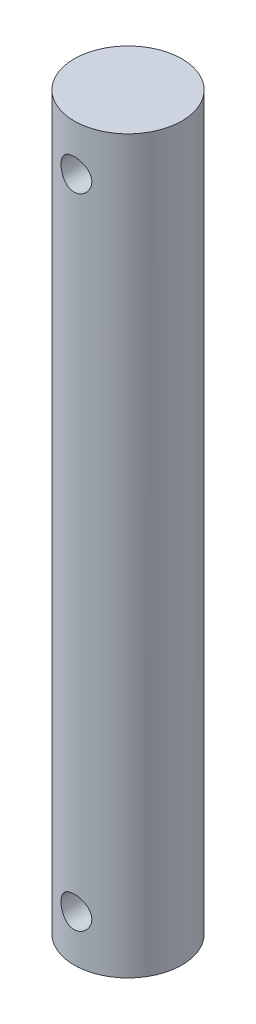
ISO-10303-21;
HEADER;
FILE_DESCRIPTION(('STEP AP214'),'2;1');
FILE_NAME('part.step','',(''),(''),'','','');
FILE_SCHEMA(('AUTOMOTIVE_DESIGN { 1 0 10303 214 1 1 1 1 }'));
ENDSEC;
DATA;
#1=APPLICATION_CONTEXT('core data for automotive mechanical design processes');
#2=APPLICATION_PROTOCOL_DEFINITION('international standard','automotive_design',2000,#1);
#3=PRODUCT_CONTEXT('',#1,'mechanical');
#4=PRODUCT('Part','Part','',(#3));
#5=PRODUCT_RELATED_PRODUCT_CATEGORY('part','',(#4));
#6=PRODUCT_DEFINITION_FORMATION('','',#4);
#7=PRODUCT_DEFINITION_CONTEXT('part definition',#1,'design');
#8=PRODUCT_DEFINITION('design','',#6,#7);
#9=PRODUCT_DEFINITION_SHAPE('','',#8);
#10=(LENGTH_UNIT() NAMED_UNIT(*) SI_UNIT(.MILLI.,.METRE.));
#11=(NAMED_UNIT(*) PLANE_ANGLE_UNIT() SI_UNIT($,.RADIAN.));
#12=(NAMED_UNIT(*) SI_UNIT($,.STERADIAN.) SOLID_ANGLE_UNIT());
#13=UNCERTAINTY_MEASURE_WITH_UNIT(LENGTH_MEASURE(1.E-05),#10,'distance_accuracy_value','');
#14=(GEOMETRIC_REPRESENTATION_CONTEXT(3) GLOBAL_UNCERTAINTY_ASSIGNED_CONTEXT((#13)) GLOBAL_UNIT_ASSIGNED_CONTEXT((#10,
#11,#12)) REPRESENTATION_CONTEXT('',''));
#15=CARTESIAN_POINT('',(0.,0.,0.));
#16=DIRECTION('',(0.,0.,1.));
#17=DIRECTION('',(1.,0.,0.));
#18=AXIS2_PLACEMENT_3D('',#15,#16,#17);
#19=CARTESIAN_POINT('',(0.,54.5,0.));
#20=DIRECTION('',(0.,-1.,0.));
#21=DIRECTION('',(0.,0.,-1.));
#22=AXIS2_PLACEMENT_3D('',#19,#20,#21);
#23=CYLINDRICAL_SURFACE('',#22,3.5);
#24=CARTESIAN_POINT('',(0.,51.5,0.));
#25=DIRECTION('',(0.,1.,0.));
#26=DIRECTION('',(0.,0.,1.));
#27=AXIS2_PLACEMENT_3D('',#24,#25,#26);
#28=CIRCLE('',#27,3.5);
#29=CARTESIAN_POINT('',(0.,51.5,3.5));
#30=VERTEX_POINT('',#29);
#31=EDGE_CURVE('E70',#30,#30,#28,.T.);
#32=ORIENTED_EDGE('',*,*,#31,.F.);
#33=EDGE_LOOP('',(#32));
#34=FACE_BOUND('',#33,.T.);
#35=CARTESIAN_POINT('',(0.,8.,-3.5));
#36=CARTESIAN_POINT('',(-0.0549774511886257,7.99999903021903,-3.49999934647171));
#37=CARTESIAN_POINT('',(-0.109964873936291,7.99545110551194,-3.49869208701023));
#38=CARTESIAN_POINT('',(-0.218345995598494,7.97741786494885,-3.49360452972549));
#39=CARTESIAN_POINT('',(-0.271739083414807,7.96392916696296,-3.48982329605034));
#40=CARTESIAN_POINT('',(-0.375352150368936,7.92849598079175,-3.48020345674544));
#41=CARTESIAN_POINT('',(-0.425576440424114,7.90656328192402,-3.474367720532));
#42=CARTESIAN_POINT('',(-0.521634380564635,7.85491100426084,-3.46124989158242));
#43=CARTESIAN_POINT('',(-0.567467570589077,7.82519061075486,-3.45396764753901));
#44=CARTESIAN_POINT('',(-0.654647223429478,7.7579824946635,-3.43852367312902));
#45=CARTESIAN_POINT('',(-0.695861861190489,7.72032762307222,-3.4303452097302));
#46=CARTESIAN_POINT('',(-0.771485678962154,7.63867612843131,-3.41413367457396));
#47=CARTESIAN_POINT('',(-0.805893838538838,7.59467855618443,-3.40610062478085));
#48=CARTESIAN_POINT('',(-0.867598950032228,7.50050320860399,-3.39091507439313));
#49=CARTESIAN_POINT('',(-0.894739105517028,7.45021900746547,-3.38378351259108));
#50=CARTESIAN_POINT('',(-0.940125852769615,7.34556399412672,-3.37145671914235));
#51=CARTESIAN_POINT('',(-0.958374357777524,7.2911940639724,-3.36626107099664));
#52=CARTESIAN_POINT('',(-0.984992165068876,7.18138261841595,-3.35856804120241));
#53=CARTESIAN_POINT('',(-0.993602766016075,7.12600431860089,-3.35600489366891));
#54=CARTESIAN_POINT('',(-1.00145333894795,7.01453442575838,-3.35367104182518));
#55=CARTESIAN_POINT('',(-1.00069534704803,6.95844299036685,-3.35389973075333));
#56=CARTESIAN_POINT('',(-0.990020673813953,6.8490656942732,-3.35706517184156));
#57=CARTESIAN_POINT('',(-0.980401628641805,6.79574782440997,-3.35991391343389));
#58=CARTESIAN_POINT('',(-0.952756930429097,6.69151639018586,-3.36785674196985));
#59=CARTESIAN_POINT('',(-0.934730517406289,6.64060304363966,-3.37295103189706));
#60=CARTESIAN_POINT('',(-0.890553405689019,6.54187687778419,-3.38488431756517));
#61=CARTESIAN_POINT('',(-0.864302755864396,6.49411146379919,-3.39174458202416));
#62=CARTESIAN_POINT('',(-0.804491895839434,6.40356171939327,-3.40642608441438));
#63=CARTESIAN_POINT('',(-0.770930058366727,6.36077850113254,-3.41424753611068));
#64=CARTESIAN_POINT('',(-0.695951998365101,6.27971381219682,-3.43033125328062));
#65=CARTESIAN_POINT('',(-0.654287437422663,6.24166276201639,-3.43859902286152));
#66=CARTESIAN_POINT('',(-0.565066141193113,6.17303699817986,-3.45438123609203));
#67=CARTESIAN_POINT('',(-0.517509100740946,6.14246267197914,-3.46189564068921));
#68=CARTESIAN_POINT('',(-0.417461536545723,6.08953563261298,-3.47538264032742));
#69=CARTESIAN_POINT('',(-0.364944908905003,6.06722985659791,-3.48134637748612));
#70=CARTESIAN_POINT('',(-0.256696614983735,6.03183305429159,-3.49099625743795));
#71=CARTESIAN_POINT('',(-0.200965762905073,6.01873970537736,-3.49468297428128));
#72=CARTESIAN_POINT('',(-0.089833194322175,6.00251335714527,-3.49927437257336));
#73=CARTESIAN_POINT('',(-0.0344806734302539,5.99906765231349,-3.50026636425301));
#74=CARTESIAN_POINT('',(0.0760132634027908,6.00136363315052,-3.49961042353544));
#75=CARTESIAN_POINT('',(0.131154703878552,6.00710421642296,-3.49796280790308));
#76=CARTESIAN_POINT('',(0.238509316715159,6.02735522215813,-3.49226963342609));
#77=CARTESIAN_POINT('',(0.290759105867427,6.04168659066171,-3.48827306508862));
#78=CARTESIAN_POINT('',(0.392104343102815,6.07850025099232,-3.4783399937092));
#79=CARTESIAN_POINT('',(0.441199425624338,6.10098348544461,-3.47240326632854));
#80=CARTESIAN_POINT('',(0.536020842560038,6.15401166832262,-3.45904980584657));
#81=CARTESIAN_POINT('',(0.581651243270127,6.18472059941289,-3.45160381589488));
#82=CARTESIAN_POINT('',(0.667219264029655,6.25312625297532,-3.43608973548903));
#83=CARTESIAN_POINT('',(0.707155585421215,6.29082456503144,-3.42802150376367));
#84=CARTESIAN_POINT('',(0.781553214170353,6.3736046710256,-3.41184309815947));
#85=CARTESIAN_POINT('',(0.81579271370477,6.41888763778285,-3.40374018433795));
#86=CARTESIAN_POINT('',(0.87619765803258,6.51473129430901,-3.38869447362751));
#87=CARTESIAN_POINT('',(0.902363383738855,6.56529180037321,-3.3817516363796));
#88=CARTESIAN_POINT('',(0.945687270594172,6.67004560549588,-3.36989325638715));
#89=CARTESIAN_POINT('',(0.962893166212217,6.72421788178634,-3.36496700079018));
#90=CARTESIAN_POINT('',(0.987897250353704,6.8348549678272,-3.35771228398834));
#91=CARTESIAN_POINT('',(0.995698289511611,6.89131907755101,-3.35538303564047));
#92=CARTESIAN_POINT('',(1.00149012123096,7.00264801646077,-3.35365851547575));
#93=CARTESIAN_POINT('',(0.999840138221142,7.05749275227629,-3.35415580399703));
#94=CARTESIAN_POINT('',(0.987623554788215,7.16608736533289,-3.35777298607399));
#95=CARTESIAN_POINT('',(0.977057251899602,7.2198372790465,-3.36089279211716));
#96=CARTESIAN_POINT('',(0.947529844083142,7.32418918558376,-3.36933488579116));
#97=CARTESIAN_POINT('',(0.928655458931764,7.37481769350544,-3.37463438524179));
#98=CARTESIAN_POINT('',(0.883114746507969,7.47222936724624,-3.38683651421364));
#99=CARTESIAN_POINT('',(0.856447040215778,7.51901185063665,-3.3937394274128));
#100=CARTESIAN_POINT('',(0.795032732674125,7.60909176090262,-3.40865834474881));
#101=CARTESIAN_POINT('',(0.760046138613656,7.65222069567097,-3.41670381589509));
#102=CARTESIAN_POINT('',(0.683429920189678,7.73211194790492,-3.43284922546139));
#103=CARTESIAN_POINT('',(0.64179862536428,7.7688726595554,-3.4409491770859));
#104=CARTESIAN_POINT('',(0.551787160432695,7.83591859216331,-3.45653979786176));
#105=CARTESIAN_POINT('',(0.50326125117989,7.86601349363481,-3.46400950518705));
#106=CARTESIAN_POINT('',(0.401625264823331,7.917572892511,-3.47725697888987));
#107=CARTESIAN_POINT('',(0.34851771205737,7.93904210596653,-3.48303566935144));
#108=CARTESIAN_POINT('',(0.246458157667518,7.97042377569772,-3.49163672362653));
#109=CARTESIAN_POINT('',(0.197881503812196,7.98148676834228,-3.49474842181038));
#110=CARTESIAN_POINT('',(0.0995391843931842,7.99627482862107,-3.49893021926074));
#111=CARTESIAN_POINT('',(0.0497736788080462,8.00000087798844,-3.50000059166997));
#112=CARTESIAN_POINT('',(0.,8.,-3.5));
#113=B_SPLINE_CURVE_WITH_KNOTS('',3,(#35,#36,#37,#38,#39,#40,#41,#42,#43,#44,#45,#46,#47,#48,
#49,#50,#51,#52,#53,#54,#55,#56,#57,#58,#59,#60,#61,#62,#63,#64,#65,#66,#67,#68,#69,#70,#71,#72,
#73,#74,#75,#76,#77,#78,#79,#80,#81,#82,#83,#84,#85,#86,#87,#88,#89,#90,#91,#92,#93,#94,#95,#96,
#97,#98,#99,#100,#101,#102,#103,#104,#105,#106,#107,#108,#109,#110,#111,#112),.UNSPECIFIED.,.T.,
.F.,(4,2,2,2,2,2,2,2,2,2,2,2,2,2,2,2,2,2,2,2,2,2,2,2,2,2,2,2,2,2,2,2,2,2,2,2,2,2,4),(0.,
0.164749656271172,0.32956166989759,0.494144406447672,0.658744367717579,0.827239057653907,
0.995758989368566,1.16766537650029,1.33953475772405,1.50699754929408,1.67442394611628,
1.83642392910678,1.99843855889074,2.16250401641616,2.32660602784683,2.49689250297262,
2.66718780073735,2.83843550548235,3.00964002003317,3.17522728845111,3.34079468713335,
3.50302570235771,3.66527548283775,3.83103762668237,3.99683751589905,4.16806052438178,
4.3392775747866,4.50957286677749,4.6798165288708,4.84363340801449,5.00744482086202,
5.16958548138845,5.33175484992001,5.49933828438395,5.66696391547449,5.83888989478295,
6.01072174610257,6.15989734012185,6.30905297207072),.UNSPECIFIED.);
#114=CARTESIAN_POINT('',(0.,8.,-3.5));
#115=VERTEX_POINT('',#114);
#116=EDGE_CURVE('E42',#115,#115,#113,.T.);
#117=ORIENTED_EDGE('',*,*,#116,.T.);
#118=EDGE_LOOP('',(#117));
#119=FACE_BOUND('',#118,.T.);
#120=CARTESIAN_POINT('',(1.,7.,3.35410196624968));
#121=CARTESIAN_POINT('',(0.999999010234618,6.94507423107725,3.3541027352982));
#122=CARTESIAN_POINT('',(0.995459333009393,6.89013845792023,3.35546589937234));
#123=CARTESIAN_POINT('',(0.977461816962148,6.78186438061244,3.36075194701915));
#124=CARTESIAN_POINT('',(0.964000350683299,6.72852673545843,3.36467587174621));
#125=CARTESIAN_POINT('',(0.928646716460409,6.6250313995488,3.37460354734501));
#126=CARTESIAN_POINT('',(0.906767603258319,6.57486892408729,3.38060407621639));
#127=CARTESIAN_POINT('',(0.855241820315741,6.47891609422696,3.3940046055512));
#128=CARTESIAN_POINT('',(0.825594228332019,6.43312625981211,3.40140477214508));
#129=CARTESIAN_POINT('',(0.758462400490702,6.34590421734143,3.41700891605117));
#130=CARTESIAN_POINT('',(0.720794605566169,6.30461609893508,3.42522877981549));
#131=CARTESIAN_POINT('',(0.639085622734713,6.22884860834841,3.44140982756535));
#132=CARTESIAN_POINT('',(0.595043689579838,6.19437003343866,3.44937098116968));
#133=CARTESIAN_POINT('',(0.500823016078774,6.13258567582316,3.46431666000611));
#134=CARTESIAN_POINT('',(0.450545391880929,6.10542519012449,3.47128027250394));
#135=CARTESIAN_POINT('',(0.345904237619826,6.05999911279204,3.48326270242804));
#136=CARTESIAN_POINT('',(0.291541505437589,6.04173178937987,3.48828189845443));
#137=CARTESIAN_POINT('',(0.181779287560588,6.01508276938014,3.49569759650108));
#138=CARTESIAN_POINT('',(0.126443899064521,6.00645548914766,3.49815913505649));
#139=CARTESIAN_POINT('',(0.0150600512109633,5.99855663305838,3.50041047829849));
#140=CARTESIAN_POINT('',(-0.0409882697942731,5.99928326883132,3.50020079369491));
#141=CARTESIAN_POINT('',(-0.15049009786761,6.00990318745901,3.49718003381653));
#142=CARTESIAN_POINT('',(-0.203971773054472,6.01953080631899,3.49444435388027));
#143=CARTESIAN_POINT('',(-0.308526111088808,6.04724755123219,3.48676943165067));
#144=CARTESIAN_POINT('',(-0.359598627150253,6.06533719213106,3.48183005528105));
#145=CARTESIAN_POINT('',(-0.458536916864461,6.10965470040591,3.47019515886062));
#146=CARTESIAN_POINT('',(-0.506361521925385,6.13596938890417,3.46348102756093));
#147=CARTESIAN_POINT('',(-0.597003621795241,6.19592229319901,3.44901384486994));
#148=CARTESIAN_POINT('',(-0.639820016208003,6.22956211383323,3.44126056595877));
#149=CARTESIAN_POINT('',(-0.720816324273876,6.3046028553093,3.42522841509913));
#150=CARTESIAN_POINT('',(-0.758780788792452,6.34623471680255,3.41694064685079));
#151=CARTESIAN_POINT('',(-0.827246507874876,6.43535754592295,3.4010148689311));
#152=CARTESIAN_POINT('',(-0.857747156891286,6.48284898847439,3.39337691201241));
#153=CARTESIAN_POINT('',(-0.910616679927254,6.58286544224911,3.37957587408658));
#154=CARTESIAN_POINT('',(-0.932918688943925,6.63542761252626,3.37342505474766));
#155=CARTESIAN_POINT('',(-0.96829475748038,6.74377658175188,3.36344272188227));
#156=CARTESIAN_POINT('',(-0.98137150201329,6.79956243732834,3.35961053356453));
#157=CARTESIAN_POINT('',(-0.997537085998827,6.91074021216189,3.35484557617748));
#158=CARTESIAN_POINT('',(-1.00095074078696,6.96608090846043,3.35381855730448));
#159=CARTESIAN_POINT('',(-0.998594983598454,7.07654415795746,3.35452079870229));
#160=CARTESIAN_POINT('',(-0.992826717122485,7.1316667375073,3.35624971515342));
#161=CARTESIAN_POINT('',(-0.972558907129289,7.23882061401528,3.36217715008271));
#162=CARTESIAN_POINT('',(-0.958262310920608,7.2908937930086,3.3663182147774));
#163=CARTESIAN_POINT('',(-0.921575809332241,7.39190093599785,3.37654531970352));
#164=CARTESIAN_POINT('',(-0.899184736133866,7.44083444582255,3.38263164056921));
#165=CARTESIAN_POINT('',(-0.846309825608091,7.53551103760866,3.3962509400331));
#166=CARTESIAN_POINT('',(-0.81563945864565,7.58114522210117,3.40381598690189));
#167=CARTESIAN_POINT('',(-0.747302318424214,7.6667381867216,3.41946863275287));
#168=CARTESIAN_POINT('',(-0.709634028840686,7.70669573350605,3.42755634473907));
#169=CARTESIAN_POINT('',(-0.626854004982777,7.78118970914411,3.44367363717939));
#170=CARTESIAN_POINT('',(-0.581533855120274,7.81549748570937,3.45169203023043));
#171=CARTESIAN_POINT('',(-0.485592653528774,7.87602284069136,3.46648988523027));
#172=CARTESIAN_POINT('',(-0.434971879049092,7.90224084196119,3.47326941192714));
#173=CARTESIAN_POINT('',(-0.330216636478084,7.94559214351316,3.48478252423195));
#174=CARTESIAN_POINT('',(-0.276112399949819,7.96279419479308,3.48953154063622));
#175=CARTESIAN_POINT('',(-0.165622824274962,7.98781340097009,3.49651669811944));
#176=CARTESIAN_POINT('',(-0.109238075792719,7.99563297009066,3.4987534856151));
#177=CARTESIAN_POINT('',(0.00208911897951452,8.00149571699889,3.50042667501642));
#178=CARTESIAN_POINT('',(0.0570128155249782,7.99987207454141,3.49995851794498));
#179=CARTESIAN_POINT('',(0.165772586211002,7.98768085929485,3.49649534561067));
#180=CARTESIAN_POINT('',(0.219608712308765,7.97711371480898,3.49350045135296));
#181=CARTESIAN_POINT('',(0.324202066519794,7.94753431951058,3.48534400930059));
#182=CARTESIAN_POINT('',(0.374982516717525,7.92859841052801,3.4802020702409));
#183=CARTESIAN_POINT('',(0.472673601380731,7.88288692085726,3.46828547071724));
#184=CARTESIAN_POINT('',(0.51958363529034,7.85611012645387,3.46151055750883));
#185=CARTESIAN_POINT('',(0.609716728176955,7.7945513312876,3.44679477720104));
#186=CARTESIAN_POINT('',(0.652788664003538,7.75955495660581,3.43882522893152));
#187=CARTESIAN_POINT('',(0.732560611159188,7.68294543727302,3.42272032493228));
#188=CARTESIAN_POINT('',(0.769258856094888,7.64133046445754,3.4145849239342));
#189=CARTESIAN_POINT('',(0.836204230145643,7.55135154150232,3.39882018772077));
#190=CARTESIAN_POINT('',(0.866256583618025,7.50283902624844,3.39120975884781));
#191=CARTESIAN_POINT('',(0.91773971809804,7.40123906734251,3.37764222665283));
#192=CARTESIAN_POINT('',(0.939175324424089,7.34815420445517,3.37168419857914));
#193=CARTESIAN_POINT('',(0.970492670062521,7.24617314988425,3.36279229780033));
#194=CARTESIAN_POINT('',(0.981529499909265,7.19765482595075,3.3595621942308));
#195=CARTESIAN_POINT('',(0.996283035217829,7.09942694082203,3.35521684727178));
#196=CARTESIAN_POINT('',(1.00000089591333,7.04971756887699,3.35410127012429));
#197=CARTESIAN_POINT('',(1.,7.,3.35410196624968));
#198=B_SPLINE_CURVE_WITH_KNOTS('',3,(#120,#121,#122,#123,#124,#125,#126,#127,#128,#129,#130,
#131,#132,#133,#134,#135,#136,#137,#138,#139,#140,#141,#142,#143,#144,#145,#146,#147,#148,#149,
#150,#151,#152,#153,#154,#155,#156,#157,#158,#159,#160,#161,#162,#163,#164,#165,#166,#167,#168,
#169,#170,#171,#172,#173,#174,#175,#176,#177,#178,#179,#180,#181,#182,#183,#184,#185,#186,#187,
#188,#189,#190,#191,#192,#193,#194,#195,#196,#197),.UNSPECIFIED.,.T.,.F.,(4,2,2,2,2,2,2,2,2,2,2,
2,2,2,2,2,2,2,2,2,2,2,2,2,2,2,2,2,2,2,2,2,2,2,2,2,2,2,4),(0.,0.164594171159104,0.32925530476515,
0.493662091823938,0.658088405459393,0.826785835988801,0.995503006148133,1.16735741502495,
1.33917834504425,1.50651450509943,1.67381867271781,1.83628518817283,1.99876158968833,
2.16301451684817,2.32730346587989,2.49735806342072,2.66742645310452,2.83885260310575,
3.01022883892078,3.17577181660546,3.34129414341278,3.50302644820309,3.66478209600074,
3.83054003013244,3.99633392302106,4.16772694180382,4.33911100034377,4.50916842641098,
4.67918208530373,4.84323448834084,5.00727903537341,5.16985706186659,5.33246026763665,
5.4998988436474,5.66738374949711,5.83926806202707,6.01105598599879,6.16006644425301,
6.30905338065554),.UNSPECIFIED.);
#199=CARTESIAN_POINT('',(1.,7.,3.35410196624968));
#200=VERTEX_POINT('',#199);
#201=EDGE_CURVE('E49',#200,#200,#198,.T.);
#202=ORIENTED_EDGE('',*,*,#201,.T.);
#203=EDGE_LOOP('',(#202));
#204=FACE_BOUND('',#203,.T.);
#205=CARTESIAN_POINT('',(0.,49.5,-3.5));
#206=CARTESIAN_POINT('',(-0.0549774511886254,49.499999030219,-3.49999934647171));
#207=CARTESIAN_POINT('',(-0.10996487393629,49.4954511055119,-3.49869208701023));
#208=CARTESIAN_POINT('',(-0.218345995598493,49.4774178649488,-3.4936045297255));
#209=CARTESIAN_POINT('',(-0.271739083414807,49.463929166963,-3.48982329605034));
#210=CARTESIAN_POINT('',(-0.375352150368936,49.4284959807918,-3.48020345674544));
#211=CARTESIAN_POINT('',(-0.425576440424114,49.406563281924,-3.474367720532));
#212=CARTESIAN_POINT('',(-0.521634380564635,49.3549110042608,-3.46124989158242));
#213=CARTESIAN_POINT('',(-0.567467570589077,49.3251906107549,-3.45396764753901));
#214=CARTESIAN_POINT('',(-0.654647223429478,49.2579824946635,-3.43852367312902));
#215=CARTESIAN_POINT('',(-0.69586186119049,49.2203276230722,-3.4303452097302));
#216=CARTESIAN_POINT('',(-0.771485678962155,49.1386761284313,-3.41413367457396));
#217=CARTESIAN_POINT('',(-0.805893838538838,49.0946785561844,-3.40610062478085));
#218=CARTESIAN_POINT('',(-0.867598950032228,49.000503208604,-3.39091507439313));
#219=CARTESIAN_POINT('',(-0.894739105517028,48.9502190074655,-3.38378351259108));
#220=CARTESIAN_POINT('',(-0.940125852769615,48.8455639941267,-3.37145671914235));
#221=CARTESIAN_POINT('',(-0.958374357777523,48.7911940639724,-3.36626107099664));
#222=CARTESIAN_POINT('',(-0.984992165068876,48.6813826184159,-3.35856804120241));
#223=CARTESIAN_POINT('',(-0.993602766016076,48.6260043186009,-3.35600489366891));
#224=CARTESIAN_POINT('',(-1.00145333894795,48.5145344257584,-3.35367104182518));
#225=CARTESIAN_POINT('',(-1.00069534704803,48.4584429903668,-3.35389973075333));
#226=CARTESIAN_POINT('',(-0.990020673813952,48.3490656942732,-3.35706517184156));
#227=CARTESIAN_POINT('',(-0.980401628641804,48.29574782441,-3.35991391343389));
#228=CARTESIAN_POINT('',(-0.952756930429097,48.1915163901859,-3.36785674196985));
#229=CARTESIAN_POINT('',(-0.93473051740629,48.1406030436397,-3.37295103189705));
#230=CARTESIAN_POINT('',(-0.89055340568902,48.0418768777842,-3.38488431756517));
#231=CARTESIAN_POINT('',(-0.864302755864395,47.9941114637992,-3.39174458202416));
#232=CARTESIAN_POINT('',(-0.804491895839433,47.9035617193933,-3.40642608441438));
#233=CARTESIAN_POINT('',(-0.770930058366726,47.8607785011325,-3.41424753611068));
#234=CARTESIAN_POINT('',(-0.695951998365101,47.7797138121968,-3.43033125328062));
#235=CARTESIAN_POINT('',(-0.654287437422663,47.7416627620164,-3.43859902286152));
#236=CARTESIAN_POINT('',(-0.565066141193115,47.6730369981799,-3.45438123609203));
#237=CARTESIAN_POINT('',(-0.517509100740948,47.6424626719791,-3.46189564068921));
#238=CARTESIAN_POINT('',(-0.417461536545725,47.589535632613,-3.47538264032742));
#239=CARTESIAN_POINT('',(-0.364944908905005,47.5672298565979,-3.48134637748612));
#240=CARTESIAN_POINT('',(-0.256696614983738,47.5318330542916,-3.49099625743795));
#241=CARTESIAN_POINT('',(-0.200965762905076,47.5187397053774,-3.49468297428128));
#242=CARTESIAN_POINT('',(-0.0898331943221773,47.5025133571453,-3.49927437257336));
#243=CARTESIAN_POINT('',(-0.0344806734302556,47.4990676523135,-3.50026636425301));
#244=CARTESIAN_POINT('',(0.0760132634027893,47.5013636331505,-3.49961042353544));
#245=CARTESIAN_POINT('',(0.131154703878551,47.507104216423,-3.49796280790309));
#246=CARTESIAN_POINT('',(0.238509316715158,47.5273552221581,-3.49226963342609));
#247=CARTESIAN_POINT('',(0.290759105867427,47.5416865906617,-3.48827306508862));
#248=CARTESIAN_POINT('',(0.392104343102814,47.5785002509923,-3.4783399937092));
#249=CARTESIAN_POINT('',(0.441199425624336,47.6009834854446,-3.47240326632854));
#250=CARTESIAN_POINT('',(0.536020842560036,47.6540116683226,-3.45904980584657));
#251=CARTESIAN_POINT('',(0.581651243270126,47.6847205994129,-3.45160381589488));
#252=CARTESIAN_POINT('',(0.667219264029654,47.7531262529753,-3.43608973548903));
#253=CARTESIAN_POINT('',(0.707155585421213,47.7908245650314,-3.42802150376367));
#254=CARTESIAN_POINT('',(0.781553214170352,47.8736046710256,-3.41184309815947));
#255=CARTESIAN_POINT('',(0.815792713704769,47.9188876377828,-3.40374018433795));
#256=CARTESIAN_POINT('',(0.876197658032579,48.014731294309,-3.38869447362751));
#257=CARTESIAN_POINT('',(0.902363383738854,48.0652918003732,-3.3817516363796));
#258=CARTESIAN_POINT('',(0.945687270594171,48.1700456054959,-3.36989325638715));
#259=CARTESIAN_POINT('',(0.962893166212216,48.2242178817863,-3.36496700079018));
#260=CARTESIAN_POINT('',(0.987897250353704,48.3348549678272,-3.35771228398834));
#261=CARTESIAN_POINT('',(0.995698289511611,48.391319077551,-3.35538303564047));
#262=CARTESIAN_POINT('',(1.00149012123096,48.5026480164608,-3.35365851547575));
#263=CARTESIAN_POINT('',(0.999840138221142,48.5574927522763,-3.35415580399703));
#264=CARTESIAN_POINT('',(0.987623554788215,48.6660873653329,-3.35777298607399));
#265=CARTESIAN_POINT('',(0.977057251899602,48.7198372790465,-3.36089279211716));
#266=CARTESIAN_POINT('',(0.947529844083144,48.8241891855838,-3.36933488579116));
#267=CARTESIAN_POINT('',(0.928655458931766,48.8748176935054,-3.37463438524179));
#268=CARTESIAN_POINT('',(0.883114746507973,48.9722293672462,-3.38683651421364));
#269=CARTESIAN_POINT('',(0.856447040215782,49.0190118506367,-3.39373942741279));
#270=CARTESIAN_POINT('',(0.795032732674129,49.1090917609026,-3.40865834474881));
#271=CARTESIAN_POINT('',(0.760046138613661,49.152220695671,-3.41670381589508));
#272=CARTESIAN_POINT('',(0.683429920189683,49.2321119479049,-3.43284922546139));
#273=CARTESIAN_POINT('',(0.641798625364285,49.2688726595554,-3.4409491770859));
#274=CARTESIAN_POINT('',(0.5517871604327,49.3359185921633,-3.45653979786176));
#275=CARTESIAN_POINT('',(0.503261251179895,49.3660134936348,-3.46400950518705));
#276=CARTESIAN_POINT('',(0.401625264823334,49.417572892511,-3.47725697888987));
#277=CARTESIAN_POINT('',(0.348517712057371,49.4390421059665,-3.48303566935144));
#278=CARTESIAN_POINT('',(0.246458157667517,49.4704237756977,-3.49163672362653));
#279=CARTESIAN_POINT('',(0.197881503812196,49.4814867683423,-3.49474842181038));
#280=CARTESIAN_POINT('',(0.0995391843931841,49.4962748286211,-3.49893021926074));
#281=CARTESIAN_POINT('',(0.049773678808046,49.5000008779884,-3.50000059166997));
#282=CARTESIAN_POINT('',(0.,49.5,-3.5));
#283=B_SPLINE_CURVE_WITH_KNOTS('',3,(#205,#206,#207,#208,#209,#210,#211,#212,#213,#214,#215,
#216,#217,#218,#219,#220,#221,#222,#223,#224,#225,#226,#227,#228,#229,#230,#231,#232,#233,#234,
#235,#236,#237,#238,#239,#240,#241,#242,#243,#244,#245,#246,#247,#248,#249,#250,#251,#252,#253,
#254,#255,#256,#257,#258,#259,#260,#261,#262,#263,#264,#265,#266,#267,#268,#269,#270,#271,#272,
#273,#274,#275,#276,#277,#278,#279,#280,#281,#282),.UNSPECIFIED.,.T.,.F.,(4,2,2,2,2,2,2,2,2,2,2,
2,2,2,2,2,2,2,2,2,2,2,2,2,2,2,2,2,2,2,2,2,2,2,2,2,2,2,4),(0.,0.164749656271171,
0.329561669897589,0.494144406447673,0.658744367717578,0.827239057653908,0.99575898936857,
1.16766537650028,1.33953475772405,1.50699754929409,1.67442394611628,1.83642392910678,
1.99843855889074,2.16250401641616,2.32660602784683,2.49689250297262,2.66718780073735,
2.83843550548235,3.00964002003317,3.17522728845111,3.34079468713335,3.50302570235771,
3.66527548283775,3.83103762668237,3.99683751589904,4.16806052438179,4.3392775747866,
4.50957286677748,4.6798165288708,4.84363340801449,5.00744482086202,5.16958548138845,
5.33175484992001,5.49933828438394,5.66696391547448,5.83888989478295,6.01072174610257,
6.15989734012186,6.30905297207072),.UNSPECIFIED.);
#284=CARTESIAN_POINT('',(0.,49.5,-3.5));
#285=VERTEX_POINT('',#284);
#286=EDGE_CURVE('E10',#285,#285,#283,.T.);
#287=ORIENTED_EDGE('',*,*,#286,.T.);
#288=EDGE_LOOP('',(#287));
#289=FACE_BOUND('',#288,.T.);
#290=CARTESIAN_POINT('',(1.,48.5,3.35410196624968));
#291=CARTESIAN_POINT('',(0.999999010234618,48.4450742310772,3.3541027352982));
#292=CARTESIAN_POINT('',(0.995459333009393,48.3901384579202,3.35546589937234));
#293=CARTESIAN_POINT('',(0.977461816962149,48.2818643806124,3.36075194701915));
#294=CARTESIAN_POINT('',(0.9640003506833,48.2285267354584,3.36467587174621));
#295=CARTESIAN_POINT('',(0.92864671646041,48.1250313995488,3.37460354734501));
#296=CARTESIAN_POINT('',(0.906767603258319,48.0748689240873,3.38060407621639));
#297=CARTESIAN_POINT('',(0.85524182031574,47.978916094227,3.3940046055512));
#298=CARTESIAN_POINT('',(0.825594228332018,47.9331262598121,3.40140477214508));
#299=CARTESIAN_POINT('',(0.758462400490702,47.8459042173414,3.41700891605117));
#300=CARTESIAN_POINT('',(0.720794605566172,47.8046160989351,3.42522877981549));
#301=CARTESIAN_POINT('',(0.639085622734717,47.7288486083484,3.44140982756535));
#302=CARTESIAN_POINT('',(0.59504368957984,47.6943700334387,3.44937098116968));
#303=CARTESIAN_POINT('',(0.500823016078777,47.6325856758232,3.46431666000612));
#304=CARTESIAN_POINT('',(0.450545391880931,47.6054251901245,3.47128027250394));
#305=CARTESIAN_POINT('',(0.345904237619828,47.559999112792,3.48326270242804));
#306=CARTESIAN_POINT('',(0.291541505437589,47.5417317893799,3.48828189845443));
#307=CARTESIAN_POINT('',(0.181779287560588,47.5150827693801,3.49569759650108));
#308=CARTESIAN_POINT('',(0.12644389906452,47.5064554891477,3.49815913505649));
#309=CARTESIAN_POINT('',(0.0150600512109622,47.4985566330584,3.50041047829849));
#310=CARTESIAN_POINT('',(-0.0409882697942744,47.4992832688313,3.50020079369491));
#311=CARTESIAN_POINT('',(-0.150490097867611,47.509903187459,3.49718003381653));
#312=CARTESIAN_POINT('',(-0.203971773054474,47.519530806319,3.49444435388027));
#313=CARTESIAN_POINT('',(-0.308526111088809,47.5472475512322,3.48676943165067));
#314=CARTESIAN_POINT('',(-0.359598627150254,47.5653371921311,3.48183005528105));
#315=CARTESIAN_POINT('',(-0.458536916864462,47.6096547004059,3.47019515886062));
#316=CARTESIAN_POINT('',(-0.506361521925388,47.6359693889042,3.46348102756093));
#317=CARTESIAN_POINT('',(-0.597003621795242,47.695922293199,3.44901384486994));
#318=CARTESIAN_POINT('',(-0.639820016208003,47.7295621138332,3.44126056595877));
#319=CARTESIAN_POINT('',(-0.720816324273876,47.8046028553093,3.42522841509913));
#320=CARTESIAN_POINT('',(-0.758780788792453,47.8462347168026,3.41694064685079));
#321=CARTESIAN_POINT('',(-0.827246507874878,47.9353575459229,3.4010148689311));
#322=CARTESIAN_POINT('',(-0.857747156891288,47.9828489884744,3.39337691201241));
#323=CARTESIAN_POINT('',(-0.910616679927257,48.0828654422491,3.37957587408658));
#324=CARTESIAN_POINT('',(-0.932918688943928,48.1354276125263,3.37342505474766));
#325=CARTESIAN_POINT('',(-0.968294757480382,48.2437765817519,3.36344272188227));
#326=CARTESIAN_POINT('',(-0.981371502013292,48.2995624373283,3.35961053356453));
#327=CARTESIAN_POINT('',(-0.997537085998827,48.4107402121619,3.35484557617748));
#328=CARTESIAN_POINT('',(-1.00095074078696,48.4660809084604,3.35381855730447));
#329=CARTESIAN_POINT('',(-0.998594983598455,48.5765441579575,3.35452079870229));
#330=CARTESIAN_POINT('',(-0.992826717122485,48.6316667375073,3.35624971515342));
#331=CARTESIAN_POINT('',(-0.972558907129289,48.7388206140153,3.36217715008271));
#332=CARTESIAN_POINT('',(-0.958262310920606,48.7908937930086,3.3663182147774));
#333=CARTESIAN_POINT('',(-0.92157580933224,48.8919009359979,3.37654531970352));
#334=CARTESIAN_POINT('',(-0.899184736133865,48.9408344458226,3.38263164056921));
#335=CARTESIAN_POINT('',(-0.846309825608091,49.0355110376087,3.3962509400331));
#336=CARTESIAN_POINT('',(-0.815639458645651,49.0811452221012,3.40381598690189));
#337=CARTESIAN_POINT('',(-0.747302318424216,49.1667381867216,3.41946863275287));
#338=CARTESIAN_POINT('',(-0.709634028840687,49.2066957335061,3.42755634473907));
#339=CARTESIAN_POINT('',(-0.626854004982777,49.2811897091441,3.44367363717939));
#340=CARTESIAN_POINT('',(-0.581533855120274,49.3154974857094,3.45169203023043));
#341=CARTESIAN_POINT('',(-0.485592653528773,49.3760228406914,3.46648988523027));
#342=CARTESIAN_POINT('',(-0.43497187904909,49.4022408419612,3.47326941192714));
#343=CARTESIAN_POINT('',(-0.33021663647808,49.4455921435132,3.48478252423195));
#344=CARTESIAN_POINT('',(-0.276112399949814,49.4627941947931,3.48953154063622));
#345=CARTESIAN_POINT('',(-0.165622824274958,49.4878134009701,3.49651669811944));
#346=CARTESIAN_POINT('',(-0.109238075792716,49.4956329700907,3.4987534856151));
#347=CARTESIAN_POINT('',(0.00208911897951615,49.5014957169989,3.50042667501642));
#348=CARTESIAN_POINT('',(0.0570128155249795,49.4998720745414,3.49995851794498));
#349=CARTESIAN_POINT('',(0.165772586211003,49.4876808592949,3.49649534561067));
#350=CARTESIAN_POINT('',(0.219608712308766,49.477113714809,3.49350045135296));
#351=CARTESIAN_POINT('',(0.324202066519794,49.4475343195106,3.48534400930059));
#352=CARTESIAN_POINT('',(0.374982516717525,49.428598410528,3.4802020702409));
#353=CARTESIAN_POINT('',(0.47267360138073,49.3828869208573,3.46828547071724));
#354=CARTESIAN_POINT('',(0.519583635290338,49.3561101264539,3.46151055750883));
#355=CARTESIAN_POINT('',(0.609716728176953,49.2945513312876,3.44679477720104));
#356=CARTESIAN_POINT('',(0.652788664003535,49.2595549566058,3.43882522893152));
#357=CARTESIAN_POINT('',(0.732560611159186,49.182945437273,3.42272032493228));
#358=CARTESIAN_POINT('',(0.769258856094887,49.1413304644575,3.4145849239342));
#359=CARTESIAN_POINT('',(0.836204230145641,49.0513515415023,3.39882018772077));
#360=CARTESIAN_POINT('',(0.86625658361802,49.0028390262484,3.39120975884781));
#361=CARTESIAN_POINT('',(0.917739718098036,48.9012390673425,3.37764222665284));
#362=CARTESIAN_POINT('',(0.939175324424088,48.8481542044552,3.37168419857914));
#363=CARTESIAN_POINT('',(0.970492670062521,48.7461731498842,3.36279229780033));
#364=CARTESIAN_POINT('',(0.981529499909265,48.6976548259507,3.3595621942308));
#365=CARTESIAN_POINT('',(0.996283035217829,48.599426940822,3.35521684727178));
#366=CARTESIAN_POINT('',(1.00000089591333,48.549717568877,3.35410127012429));
#367=CARTESIAN_POINT('',(1.,48.5,3.35410196624968));
#368=B_SPLINE_CURVE_WITH_KNOTS('',3,(#290,#291,#292,#293,#294,#295,#296,#297,#298,#299,#300,
#301,#302,#303,#304,#305,#306,#307,#308,#309,#310,#311,#312,#313,#314,#315,#316,#317,#318,#319,
#320,#321,#322,#323,#324,#325,#326,#327,#328,#329,#330,#331,#332,#333,#334,#335,#336,#337,#338,
#339,#340,#341,#342,#343,#344,#345,#346,#347,#348,#349,#350,#351,#352,#353,#354,#355,#356,#357,
#358,#359,#360,#361,#362,#363,#364,#365,#366,#367),.UNSPECIFIED.,.T.,.F.,(4,2,2,2,2,2,2,2,2,2,2,
2,2,2,2,2,2,2,2,2,2,2,2,2,2,2,2,2,2,2,2,2,2,2,2,2,2,2,4),(0.,0.164594171159105,0.32925530476515,
0.493662091823938,0.658088405459392,0.826785835988794,0.995503006148128,1.16735741502495,
1.33917834504425,1.50651450509943,1.67381867271781,1.83628518817283,1.99876158968833,
2.16301451684818,2.32730346587989,2.49735806342072,2.66742645310452,2.83885260310575,
3.01022883892078,3.17577181660545,3.34129414341278,3.50302644820309,3.66478209600074,
3.83054003013244,3.99633392302106,4.16772694180382,4.33911100034377,4.50916842641098,
4.67918208530373,4.84323448834084,5.0072790353734,5.16985706186659,5.33246026763665,
5.49989884364739,5.6673837494971,5.83926806202705,6.01105598599879,6.160066444253,
6.30905338065554),.UNSPECIFIED.);
#369=CARTESIAN_POINT('',(1.,48.5,3.35410196624968));
#370=VERTEX_POINT('',#369);
#371=EDGE_CURVE('E37',#370,#370,#368,.T.);
#372=ORIENTED_EDGE('',*,*,#371,.T.);
#373=EDGE_LOOP('',(#372));
#374=FACE_BOUND('',#373,.T.);
#375=CARTESIAN_POINT('',(0.,4.,0.));
#376=DIRECTION('',(0.,-1.,0.));
#377=DIRECTION('',(0.,0.,-1.));
#378=AXIS2_PLACEMENT_3D('',#375,#376,#377);
#379=CIRCLE('',#378,3.5);
#380=CARTESIAN_POINT('',(0.,4.,-3.5));
#381=VERTEX_POINT('',#380);
#382=EDGE_CURVE('E33',#381,#381,#379,.T.);
#383=ORIENTED_EDGE('',*,*,#382,.F.);
#384=EDGE_LOOP('',(#383));
#385=FACE_BOUND('',#384,.T.);
#386=ADVANCED_FACE('F29',(#34,#119,#204,#289,#374,#385),#23,.T.);
#387=CARTESIAN_POINT('',(0.,48.5,-27.25));
#388=DIRECTION('',(0.,0.,1.));
#389=DIRECTION('',(1.,0.,0.));
#390=AXIS2_PLACEMENT_3D('',#387,#388,#389);
#391=CYLINDRICAL_SURFACE('',#390,1.);
#392=ORIENTED_EDGE('',*,*,#371,.F.);
#393=EDGE_LOOP('',(#392));
#394=FACE_BOUND('',#393,.T.);
#395=ORIENTED_EDGE('',*,*,#286,.F.);
#396=EDGE_LOOP('',(#395));
#397=FACE_BOUND('',#396,.T.);
#398=ADVANCED_FACE('F54',(#394,#397),#391,.F.);
#399=CARTESIAN_POINT('',(0.,7.,-27.25));
#400=DIRECTION('',(0.,0.,1.));
#401=DIRECTION('',(1.,0.,0.));
#402=AXIS2_PLACEMENT_3D('',#399,#400,#401);
#403=CYLINDRICAL_SURFACE('',#402,1.);
#404=ORIENTED_EDGE('',*,*,#201,.F.);
#405=EDGE_LOOP('',(#404));
#406=FACE_BOUND('',#405,.T.);
#407=ORIENTED_EDGE('',*,*,#116,.F.);
#408=EDGE_LOOP('',(#407));
#409=FACE_BOUND('',#408,.T.);
#410=ADVANCED_FACE('F57',(#406,#409),#403,.F.);
#411=CARTESIAN_POINT('',(0.,51.5,0.));
#412=DIRECTION('',(0.,1.,0.));
#413=DIRECTION('',(0.,0.,1.));
#414=AXIS2_PLACEMENT_3D('',#411,#412,#413);
#415=PLANE('',#414);
#416=ORIENTED_EDGE('',*,*,#31,.T.);
#417=EDGE_LOOP('',(#416));
#418=FACE_BOUND('',#417,.T.);
#419=ADVANCED_FACE('F63',(#418),#415,.T.);
#420=CARTESIAN_POINT('',(0.,4.,0.));
#421=DIRECTION('',(0.,-1.,0.));
#422=DIRECTION('',(0.,0.,-1.));
#423=AXIS2_PLACEMENT_3D('',#420,#421,#422);
#424=PLANE('',#423);
#425=ORIENTED_EDGE('',*,*,#382,.T.);
#426=EDGE_LOOP('',(#425));
#427=FACE_BOUND('',#426,.T.);
#428=ADVANCED_FACE('F78',(#427),#424,.T.);
#429=CLOSED_SHELL('',(#386,#398,#410,#419,#428));
#430=MANIFOLD_SOLID_BREP('B2',#429);
#431=ADVANCED_BREP_SHAPE_REPRESENTATION('',(#18,#430),#14);
#432=SHAPE_DEFINITION_REPRESENTATION(#9,#431);
ENDSEC;
END-ISO-10303-21;
